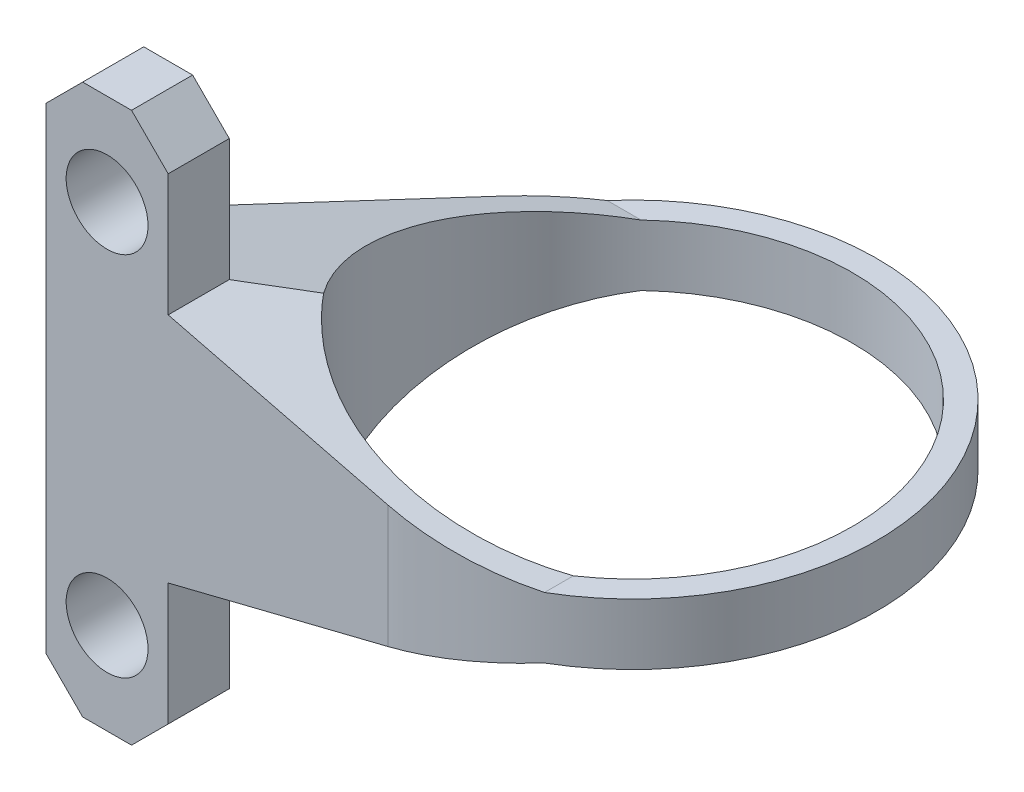
ISO-10303-21;
HEADER;
FILE_DESCRIPTION(('STEP AP214'),'2;1');
FILE_NAME('part.step','',(''),(''),'','','');
FILE_SCHEMA(('AUTOMOTIVE_DESIGN { 1 0 10303 214 1 1 1 1 }'));
ENDSEC;
DATA;
#1=APPLICATION_CONTEXT('core data for automotive mechanical design processes');
#2=APPLICATION_PROTOCOL_DEFINITION('international standard','automotive_design',2000,#1);
#3=PRODUCT_CONTEXT('',#1,'mechanical');
#4=PRODUCT('Part','Part','',(#3));
#5=PRODUCT_RELATED_PRODUCT_CATEGORY('part','',(#4));
#6=PRODUCT_DEFINITION_FORMATION('','',#4);
#7=PRODUCT_DEFINITION_CONTEXT('part definition',#1,'design');
#8=PRODUCT_DEFINITION('design','',#6,#7);
#9=PRODUCT_DEFINITION_SHAPE('','',#8);
#10=(LENGTH_UNIT() NAMED_UNIT(*) SI_UNIT(.MILLI.,.METRE.));
#11=(NAMED_UNIT(*) PLANE_ANGLE_UNIT() SI_UNIT($,.RADIAN.));
#12=(NAMED_UNIT(*) SI_UNIT($,.STERADIAN.) SOLID_ANGLE_UNIT());
#13=UNCERTAINTY_MEASURE_WITH_UNIT(LENGTH_MEASURE(1.E-05),#10,'distance_accuracy_value','');
#14=(GEOMETRIC_REPRESENTATION_CONTEXT(3) GLOBAL_UNCERTAINTY_ASSIGNED_CONTEXT((#13)) GLOBAL_UNIT_ASSIGNED_CONTEXT((#10,
#11,#12)) REPRESENTATION_CONTEXT('',''));
#15=CARTESIAN_POINT('',(0.,0.,0.));
#16=DIRECTION('',(0.,0.,1.));
#17=DIRECTION('',(1.,0.,0.));
#18=AXIS2_PLACEMENT_3D('',#15,#16,#17);
#19=CARTESIAN_POINT('',(0.,0.,0.));
#20=DIRECTION('',(0.,0.,1.));
#21=DIRECTION('',(1.,0.,0.));
#22=AXIS2_PLACEMENT_3D('',#19,#20,#21);
#23=PLANE('',#22);
#24=CARTESIAN_POINT('',(0.,-15.,0.));
#25=DIRECTION('',(0.,0.,1.));
#26=DIRECTION('',(1.,0.,0.));
#27=AXIS2_PLACEMENT_3D('',#24,#25,#26);
#28=CIRCLE('',#27,3.35);
#29=CARTESIAN_POINT('',(3.35,-15.,0.));
#30=VERTEX_POINT('',#29);
#31=EDGE_CURVE('E196',#30,#30,#28,.T.);
#32=ORIENTED_EDGE('',*,*,#31,.T.);
#33=EDGE_LOOP('',(#32));
#34=FACE_BOUND('',#33,.T.);
#35=DIRECTION('',(0.,-1.,0.));
#36=VECTOR('',#35,1.);
#37=CARTESIAN_POINT('',(-5.,22.5,0.));
#38=LINE('',#37,#36);
#39=CARTESIAN_POINT('',(-5.,-9.50000000000018,0.));
#40=VERTEX_POINT('',#39);
#41=CARTESIAN_POINT('',(-5.,-19.5,0.));
#42=VERTEX_POINT('',#41);
#43=EDGE_CURVE('E225',#40,#42,#38,.T.);
#44=ORIENTED_EDGE('',*,*,#43,.F.);
#45=DIRECTION('',(1.,0.,0.));
#46=VECTOR('',#45,1.);
#47=CARTESIAN_POINT('',(5.,-9.5000000000002,0.));
#48=LINE('',#47,#46);
#49=CARTESIAN_POINT('',(5.,-9.50000000000018,0.));
#50=VERTEX_POINT('',#49);
#51=EDGE_CURVE('E173',#40,#50,#48,.T.);
#52=ORIENTED_EDGE('',*,*,#51,.T.);
#53=DIRECTION('',(0.,1.,0.));
#54=VECTOR('',#53,1.);
#55=CARTESIAN_POINT('',(5.,22.5,0.));
#56=LINE('',#55,#54);
#57=CARTESIAN_POINT('',(5.,-19.5,0.));
#58=VERTEX_POINT('',#57);
#59=EDGE_CURVE('E219',#58,#50,#56,.T.);
#60=ORIENTED_EDGE('',*,*,#59,.F.);
#61=DIRECTION('',(0.707106781186548,0.707106781186547,0.));
#62=VECTOR('',#61,1.);
#63=CARTESIAN_POINT('',(5.,-19.5,0.));
#64=LINE('',#63,#62);
#65=CARTESIAN_POINT('',(1.99999999999999,-22.5,0.));
#66=VERTEX_POINT('',#65);
#67=EDGE_CURVE('E236',#58,#66,#64,.F.);
#68=ORIENTED_EDGE('',*,*,#67,.T.);
#69=DIRECTION('',(1.,0.,0.));
#70=VECTOR('',#69,1.);
#71=CARTESIAN_POINT('',(-5.,-22.5,0.));
#72=LINE('',#71,#70);
#73=CARTESIAN_POINT('',(-2.,-22.5,0.));
#74=VERTEX_POINT('',#73);
#75=EDGE_CURVE('E228',#74,#66,#72,.T.);
#76=ORIENTED_EDGE('',*,*,#75,.F.);
#77=DIRECTION('',(0.707106781186547,-0.707106781186548,0.));
#78=VECTOR('',#77,1.);
#79=CARTESIAN_POINT('',(-2.,-22.5,0.));
#80=LINE('',#79,#78);
#81=EDGE_CURVE('E239',#74,#42,#80,.F.);
#82=ORIENTED_EDGE('',*,*,#81,.T.);
#83=EDGE_LOOP('',(#44,#52,#60,#68,#76,#82));
#84=FACE_BOUND('',#83,.T.);
#85=ADVANCED_FACE('F39',(#34,#84),#23,.F.);
#86=CARTESIAN_POINT('',(5.,22.5,5.));
#87=DIRECTION('',(-1.,0.,0.));
#88=DIRECTION('',(0.,-1.,0.));
#89=AXIS2_PLACEMENT_3D('',#86,#87,#88);
#90=PLANE('',#89);
#91=ORIENTED_EDGE('',*,*,#59,.T.);
#92=DIRECTION('',(0.,0.,1.));
#93=VECTOR('',#92,1.);
#94=CARTESIAN_POINT('',(5.,-9.5000000000002,5.));
#95=LINE('',#94,#93);
#96=CARTESIAN_POINT('',(5.,-9.50000000000019,5.));
#97=VERTEX_POINT('',#96);
#98=EDGE_CURVE('E168',#50,#97,#95,.T.);
#99=ORIENTED_EDGE('',*,*,#98,.T.);
#100=DIRECTION('',(0.,1.,0.));
#101=VECTOR('',#100,1.);
#102=CARTESIAN_POINT('',(5.,22.5,5.));
#103=LINE('',#102,#101);
#104=CARTESIAN_POINT('',(5.,-19.5,5.));
#105=VERTEX_POINT('',#104);
#106=EDGE_CURVE('E205',#105,#97,#103,.T.);
#107=ORIENTED_EDGE('',*,*,#106,.F.);
#108=DIRECTION('',(0.,0.,-1.));
#109=VECTOR('',#108,1.);
#110=CARTESIAN_POINT('',(5.,-19.5,5.));
#111=LINE('',#110,#109);
#112=EDGE_CURVE('E260',#105,#58,#111,.T.);
#113=ORIENTED_EDGE('',*,*,#112,.T.);
#114=EDGE_LOOP('',(#91,#99,#107,#113));
#115=FACE_BOUND('',#114,.T.);
#116=ADVANCED_FACE('F387',(#115),#90,.F.);
#117=CARTESIAN_POINT('',(0.,0.,5.));
#118=DIRECTION('',(0.,0.,1.));
#119=DIRECTION('',(1.,0.,0.));
#120=AXIS2_PLACEMENT_3D('',#117,#118,#119);
#121=PLANE('',#120);
#122=CARTESIAN_POINT('',(0.,-15.,5.));
#123=DIRECTION('',(0.,0.,1.));
#124=DIRECTION('',(1.,0.,0.));
#125=AXIS2_PLACEMENT_3D('',#122,#123,#124);
#126=CIRCLE('',#125,3.35);
#127=CARTESIAN_POINT('',(3.35,-15.,5.));
#128=VERTEX_POINT('',#127);
#129=EDGE_CURVE('E199',#128,#128,#126,.T.);
#130=ORIENTED_EDGE('',*,*,#129,.F.);
#131=EDGE_LOOP('',(#130));
#132=FACE_BOUND('',#131,.T.);
#133=DIRECTION('',(0.,-1.,0.));
#134=VECTOR('',#133,1.);
#135=CARTESIAN_POINT('',(-5.,22.5,5.));
#136=LINE('',#135,#134);
#137=CARTESIAN_POINT('',(-5.,19.5,5.));
#138=VERTEX_POINT('',#137);
#139=CARTESIAN_POINT('',(-5.,-19.5,5.));
#140=VERTEX_POINT('',#139);
#141=EDGE_CURVE('E212',#138,#140,#136,.T.);
#142=ORIENTED_EDGE('',*,*,#141,.T.);
#143=DIRECTION('',(-0.707106781186547,0.707106781186548,0.));
#144=VECTOR('',#143,1.);
#145=CARTESIAN_POINT('',(-12.25,-12.25,5.));
#146=LINE('',#145,#144);
#147=CARTESIAN_POINT('',(-2.,-22.5,5.));
#148=VERTEX_POINT('',#147);
#149=EDGE_CURVE('E257',#140,#148,#146,.F.);
#150=ORIENTED_EDGE('',*,*,#149,.T.);
#151=DIRECTION('',(1.,0.,0.));
#152=VECTOR('',#151,1.);
#153=CARTESIAN_POINT('',(-5.,-22.5,5.));
#154=LINE('',#153,#152);
#155=CARTESIAN_POINT('',(1.99999999999999,-22.5,5.));
#156=VERTEX_POINT('',#155);
#157=EDGE_CURVE('E215',#148,#156,#154,.T.);
#158=ORIENTED_EDGE('',*,*,#157,.T.);
#159=DIRECTION('',(-0.707106781186548,-0.707106781186547,0.));
#160=VECTOR('',#159,1.);
#161=CARTESIAN_POINT('',(12.25,-12.25,5.));
#162=LINE('',#161,#160);
#163=EDGE_CURVE('E254',#156,#105,#162,.F.);
#164=ORIENTED_EDGE('',*,*,#163,.T.);
#165=ORIENTED_EDGE('',*,*,#106,.T.);
#166=DIRECTION('',(-0.970295726275997,-0.241921895599665,0.));
#167=VECTOR('',#166,1.);
#168=CARTESIAN_POINT('',(5.,-9.5000000000002,5.));
#169=LINE('',#168,#167);
#170=CARTESIAN_POINT('',(23.,-5.01209594882301,5.));
#171=VERTEX_POINT('',#170);
#172=EDGE_CURVE('E138',#97,#171,#169,.F.);
#173=ORIENTED_EDGE('',*,*,#172,.T.);
#174=DIRECTION('',(0.,1.,0.));
#175=VECTOR('',#174,1.);
#176=CARTESIAN_POINT('',(23.,-2.5,5.));
#177=LINE('',#176,#175);
#178=CARTESIAN_POINT('',(23.,5.012095948823,5.));
#179=VERTEX_POINT('',#178);
#180=EDGE_CURVE('E189',#171,#179,#177,.T.);
#181=ORIENTED_EDGE('',*,*,#180,.T.);
#182=DIRECTION('',(-0.970295726275997,0.241921895599665,0.));
#183=VECTOR('',#182,1.);
#184=CARTESIAN_POINT('',(33.0754665347521,2.5,5.));
#185=LINE('',#184,#183);
#186=CARTESIAN_POINT('',(5.,9.5000000000002,5.));
#187=VERTEX_POINT('',#186);
#188=EDGE_CURVE('E85',#179,#187,#185,.T.);
#189=ORIENTED_EDGE('',*,*,#188,.T.);
#190=CARTESIAN_POINT('',(5.,19.5,5.));
#191=VERTEX_POINT('',#190);
#192=EDGE_CURVE('E209',#187,#191,#103,.T.);
#193=ORIENTED_EDGE('',*,*,#192,.T.);
#194=DIRECTION('',(0.707106781186547,-0.707106781186548,0.));
#195=VECTOR('',#194,1.);
#196=CARTESIAN_POINT('',(12.25,12.25,5.));
#197=LINE('',#196,#195);
#198=CARTESIAN_POINT('',(2.,22.5,5.));
#199=VERTEX_POINT('',#198);
#200=EDGE_CURVE('E251',#191,#199,#197,.F.);
#201=ORIENTED_EDGE('',*,*,#200,.T.);
#202=DIRECTION('',(-1.,0.,0.));
#203=VECTOR('',#202,1.);
#204=CARTESIAN_POINT('',(-5.,22.5,5.));
#205=LINE('',#204,#203);
#206=CARTESIAN_POINT('',(-1.99999999999999,22.5,5.));
#207=VERTEX_POINT('',#206);
#208=EDGE_CURVE('E208',#199,#207,#205,.T.);
#209=ORIENTED_EDGE('',*,*,#208,.T.);
#210=DIRECTION('',(0.707106781186548,0.707106781186547,0.));
#211=VECTOR('',#210,1.);
#212=CARTESIAN_POINT('',(-12.25,12.25,5.));
#213=LINE('',#212,#211);
#214=EDGE_CURVE('E248',#207,#138,#213,.F.);
#215=ORIENTED_EDGE('',*,*,#214,.T.);
#216=EDGE_LOOP('',(#142,#150,#158,#164,#165,#173,#181,#189,#193,#201,#209,#215));
#217=FACE_BOUND('',#216,.T.);
#218=CARTESIAN_POINT('',(0.,15.,5.));
#219=DIRECTION('',(0.,0.,1.));
#220=DIRECTION('',(1.,0.,0.));
#221=AXIS2_PLACEMENT_3D('',#218,#219,#220);
#222=CIRCLE('',#221,3.35);
#223=CARTESIAN_POINT('',(3.34999999999999,15.,5.));
#224=VERTEX_POINT('',#223);
#225=EDGE_CURVE('E193',#224,#224,#222,.T.);
#226=ORIENTED_EDGE('',*,*,#225,.F.);
#227=EDGE_LOOP('',(#226));
#228=FACE_BOUND('',#227,.T.);
#229=ADVANCED_FACE('F350',(#132,#217,#228),#121,.T.);
#230=CARTESIAN_POINT('',(5.,9.5000000000002,0.));
#231=VERTEX_POINT('',#230);
#232=CARTESIAN_POINT('',(5.,19.5,0.));
#233=VERTEX_POINT('',#232);
#234=EDGE_CURVE('E202',#231,#233,#56,.T.);
#235=ORIENTED_EDGE('',*,*,#234,.F.);
#236=DIRECTION('',(-1.,0.,0.));
#237=VECTOR('',#236,1.);
#238=CARTESIAN_POINT('',(0.,9.5000000000002,0.));
#239=LINE('',#238,#237);
#240=CARTESIAN_POINT('',(-5.,9.5000000000002,0.));
#241=VERTEX_POINT('',#240);
#242=EDGE_CURVE('E284',#231,#241,#239,.T.);
#243=ORIENTED_EDGE('',*,*,#242,.T.);
#244=CARTESIAN_POINT('',(-5.,19.5,0.));
#245=VERTEX_POINT('',#244);
#246=EDGE_CURVE('E226',#245,#241,#38,.T.);
#247=ORIENTED_EDGE('',*,*,#246,.F.);
#248=DIRECTION('',(-0.707106781186548,-0.707106781186547,0.));
#249=VECTOR('',#248,1.);
#250=CARTESIAN_POINT('',(-5.,19.5,0.));
#251=LINE('',#250,#249);
#252=CARTESIAN_POINT('',(-1.99999999999999,22.5,0.));
#253=VERTEX_POINT('',#252);
#254=EDGE_CURVE('E269',#245,#253,#251,.F.);
#255=ORIENTED_EDGE('',*,*,#254,.T.);
#256=DIRECTION('',(-1.,0.,0.));
#257=VECTOR('',#256,1.);
#258=CARTESIAN_POINT('',(-5.,22.5,0.));
#259=LINE('',#258,#257);
#260=CARTESIAN_POINT('',(2.,22.5,0.));
#261=VERTEX_POINT('',#260);
#262=EDGE_CURVE('E222',#261,#253,#259,.T.);
#263=ORIENTED_EDGE('',*,*,#262,.F.);
#264=DIRECTION('',(-0.707106781186547,0.707106781186548,0.));
#265=VECTOR('',#264,1.);
#266=CARTESIAN_POINT('',(2.,22.5,0.));
#267=LINE('',#266,#265);
#268=EDGE_CURVE('E272',#261,#233,#267,.F.);
#269=ORIENTED_EDGE('',*,*,#268,.T.);
#270=EDGE_LOOP('',(#235,#243,#247,#255,#263,#269));
#271=FACE_BOUND('',#270,.T.);
#272=CARTESIAN_POINT('',(0.,15.,0.));
#273=DIRECTION('',(0.,0.,1.));
#274=DIRECTION('',(1.,0.,0.));
#275=AXIS2_PLACEMENT_3D('',#272,#273,#274);
#276=CIRCLE('',#275,3.35);
#277=CARTESIAN_POINT('',(3.34999999999999,15.,0.));
#278=VERTEX_POINT('',#277);
#279=EDGE_CURVE('E191',#278,#278,#276,.T.);
#280=ORIENTED_EDGE('',*,*,#279,.T.);
#281=EDGE_LOOP('',(#280));
#282=FACE_BOUND('',#281,.T.);
#283=ADVANCED_FACE('F312',(#271,#282),#23,.F.);
#284=ORIENTED_EDGE('',*,*,#192,.F.);
#285=DIRECTION('',(0.,0.,-1.));
#286=VECTOR('',#285,1.);
#287=CARTESIAN_POINT('',(5.,9.50000000000019,5.));
#288=LINE('',#287,#286);
#289=EDGE_CURVE('E282',#187,#231,#288,.T.);
#290=ORIENTED_EDGE('',*,*,#289,.T.);
#291=ORIENTED_EDGE('',*,*,#234,.T.);
#292=DIRECTION('',(0.,0.,1.));
#293=VECTOR('',#292,1.);
#294=CARTESIAN_POINT('',(5.,19.5,5.));
#295=LINE('',#294,#293);
#296=EDGE_CURVE('E275',#233,#191,#295,.T.);
#297=ORIENTED_EDGE('',*,*,#296,.T.);
#298=EDGE_LOOP('',(#284,#290,#291,#297));
#299=FACE_BOUND('',#298,.T.);
#300=ADVANCED_FACE('F310',(#299),#90,.F.);
#301=CARTESIAN_POINT('',(-5.,22.5,5.));
#302=DIRECTION('',(0.,-1.,0.));
#303=DIRECTION('',(0.,0.,-1.));
#304=AXIS2_PLACEMENT_3D('',#301,#302,#303);
#305=PLANE('',#304);
#306=ORIENTED_EDGE('',*,*,#208,.F.);
#307=DIRECTION('',(0.,0.,-1.));
#308=VECTOR('',#307,1.);
#309=CARTESIAN_POINT('',(2.,22.5,5.));
#310=LINE('',#309,#308);
#311=EDGE_CURVE('E266',#199,#261,#310,.T.);
#312=ORIENTED_EDGE('',*,*,#311,.T.);
#313=ORIENTED_EDGE('',*,*,#262,.T.);
#314=DIRECTION('',(0.,0.,1.));
#315=VECTOR('',#314,1.);
#316=CARTESIAN_POINT('',(-1.99999999999999,22.5,5.));
#317=LINE('',#316,#315);
#318=EDGE_CURVE('E263',#253,#207,#317,.T.);
#319=ORIENTED_EDGE('',*,*,#318,.T.);
#320=EDGE_LOOP('',(#306,#312,#313,#319));
#321=FACE_BOUND('',#320,.T.);
#322=ADVANCED_FACE('F345',(#321),#305,.F.);
#323=CARTESIAN_POINT('',(-5.,22.5,5.));
#324=DIRECTION('',(1.,0.,0.));
#325=DIRECTION('',(0.,1.,0.));
#326=AXIS2_PLACEMENT_3D('',#323,#324,#325);
#327=PLANE('',#326);
#328=DIRECTION('',(0.,1.,0.));
#329=VECTOR('',#328,1.);
#330=CARTESIAN_POINT('',(-5.,-2.5,0.));
#331=LINE('',#330,#329);
#332=EDGE_CURVE('E57',#40,#241,#331,.T.);
#333=ORIENTED_EDGE('',*,*,#332,.F.);
#334=ORIENTED_EDGE('',*,*,#43,.T.);
#335=DIRECTION('',(0.,0.,1.));
#336=VECTOR('',#335,1.);
#337=CARTESIAN_POINT('',(-5.,-19.5,5.));
#338=LINE('',#337,#336);
#339=EDGE_CURVE('E245',#42,#140,#338,.T.);
#340=ORIENTED_EDGE('',*,*,#339,.T.);
#341=ORIENTED_EDGE('',*,*,#141,.F.);
#342=DIRECTION('',(0.,0.,-1.));
#343=VECTOR('',#342,1.);
#344=CARTESIAN_POINT('',(-5.,19.5,5.));
#345=LINE('',#344,#343);
#346=EDGE_CURVE('E242',#138,#245,#345,.T.);
#347=ORIENTED_EDGE('',*,*,#346,.T.);
#348=ORIENTED_EDGE('',*,*,#246,.T.);
#349=EDGE_LOOP('',(#333,#334,#340,#341,#347,#348));
#350=FACE_BOUND('',#349,.T.);
#351=ADVANCED_FACE('F354',(#350),#327,.F.);
#352=CARTESIAN_POINT('',(-5.,-22.5,5.));
#353=DIRECTION('',(0.,1.,0.));
#354=DIRECTION('',(0.,0.,1.));
#355=AXIS2_PLACEMENT_3D('',#352,#353,#354);
#356=PLANE('',#355);
#357=ORIENTED_EDGE('',*,*,#157,.F.);
#358=DIRECTION('',(0.,0.,-1.));
#359=VECTOR('',#358,1.);
#360=CARTESIAN_POINT('',(-2.,-22.5,5.));
#361=LINE('',#360,#359);
#362=EDGE_CURVE('E233',#148,#74,#361,.T.);
#363=ORIENTED_EDGE('',*,*,#362,.T.);
#364=ORIENTED_EDGE('',*,*,#75,.T.);
#365=DIRECTION('',(0.,0.,1.));
#366=VECTOR('',#365,1.);
#367=CARTESIAN_POINT('',(1.99999999999999,-22.5,5.));
#368=LINE('',#367,#366);
#369=EDGE_CURVE('E218',#66,#156,#368,.T.);
#370=ORIENTED_EDGE('',*,*,#369,.T.);
#371=EDGE_LOOP('',(#357,#363,#364,#370));
#372=FACE_BOUND('',#371,.T.);
#373=ADVANCED_FACE('F382',(#372),#356,.F.);
#374=CARTESIAN_POINT('',(0.,-15.,5.));
#375=DIRECTION('',(0.,0.,-1.));
#376=DIRECTION('',(-1.,0.,0.));
#377=AXIS2_PLACEMENT_3D('',#374,#375,#376);
#378=CYLINDRICAL_SURFACE('',#377,3.35);
#379=ORIENTED_EDGE('',*,*,#129,.T.);
#380=EDGE_LOOP('',(#379));
#381=FACE_BOUND('',#380,.T.);
#382=ORIENTED_EDGE('',*,*,#31,.F.);
#383=EDGE_LOOP('',(#382));
#384=FACE_BOUND('',#383,.T.);
#385=ADVANCED_FACE('F411',(#381,#384),#378,.F.);
#386=CARTESIAN_POINT('',(0.,15.,5.));
#387=DIRECTION('',(0.,0.,-1.));
#388=DIRECTION('',(-1.,0.,0.));
#389=AXIS2_PLACEMENT_3D('',#386,#387,#388);
#390=CYLINDRICAL_SURFACE('',#389,3.35);
#391=ORIENTED_EDGE('',*,*,#225,.T.);
#392=EDGE_LOOP('',(#391));
#393=FACE_BOUND('',#392,.T.);
#394=ORIENTED_EDGE('',*,*,#279,.F.);
#395=EDGE_LOOP('',(#394));
#396=FACE_BOUND('',#395,.T.);
#397=ADVANCED_FACE('F429',(#393,#396),#390,.F.);
#398=CARTESIAN_POINT('',(23.,-2.5,-15.));
#399=DIRECTION('',(0.,1.,0.));
#400=DIRECTION('',(0.,0.,1.));
#401=AXIS2_PLACEMENT_3D('',#398,#399,#400);
#402=CYLINDRICAL_SURFACE('',#401,20.);
#403=DIRECTION('',(0.,1.,0.));
#404=VECTOR('',#403,1.);
#405=CARTESIAN_POINT('',(4.56255935822414,-2.5,-22.7498891979816));
#406=LINE('',#405,#404);
#407=CARTESIAN_POINT('',(4.56255935822414,-3.82781556136387,-22.7498891979816));
#408=VERTEX_POINT('',#407);
#409=CARTESIAN_POINT('',(4.56255935822414,3.82781556136387,-22.7498891979816));
#410=VERTEX_POINT('',#409);
#411=EDGE_CURVE('E65',#408,#410,#406,.T.);
#412=ORIENTED_EDGE('',*,*,#411,.T.);
#413=CARTESIAN_POINT('',(23.,5.76007995735254,-15.));
#414=DIRECTION('',(0.,-0.970295726275997,0.241921895599665));
#415=DIRECTION('',(0.,0.241921895599665,0.970295726275997));
#416=AXIS2_PLACEMENT_3D('',#413,#414,#415);
#417=ELLIPSE('',#416,20.6122725869979,20.);
#418=CARTESIAN_POINT('',(7.86619099834485,2.5,-28.0754665347521));
#419=VERTEX_POINT('',#418);
#420=EDGE_CURVE('E119',#410,#419,#417,.T.);
#421=ORIENTED_EDGE('',*,*,#420,.T.);
#422=CARTESIAN_POINT('',(23.,2.5,-15.));
#423=DIRECTION('',(0.,1.,0.));
#424=DIRECTION('',(0.,0.,1.));
#425=AXIS2_PLACEMENT_3D('',#422,#423,#424);
#426=CIRCLE('',#425,20.);
#427=CARTESIAN_POINT('',(33.0754665347521,2.5,2.27671768904877));
#428=VERTEX_POINT('',#427);
#429=EDGE_CURVE('E158',#428,#419,#426,.T.);
#430=ORIENTED_EDGE('',*,*,#429,.F.);
#431=CARTESIAN_POINT('',(23.,5.012095948823,-15.));
#432=DIRECTION('',(-0.241921895599665,-0.970295726275997,0.));
#433=DIRECTION('',(-0.970295726275997,0.241921895599665,0.));
#434=AXIS2_PLACEMENT_3D('',#431,#432,#433);
#435=ELLIPSE('',#434,20.6122725869979,20.);
#436=EDGE_CURVE('E290',#428,#179,#435,.T.);
#437=ORIENTED_EDGE('',*,*,#436,.T.);
#438=ORIENTED_EDGE('',*,*,#180,.F.);
#439=CARTESIAN_POINT('',(23.,-5.01209594882301,-15.));
#440=DIRECTION('',(0.241921895599665,-0.970295726275997,0.));
#441=DIRECTION('',(0.970295726275997,0.241921895599665,0.));
#442=AXIS2_PLACEMENT_3D('',#439,#440,#441);
#443=ELLIPSE('',#442,20.6122725869979,20.);
#444=CARTESIAN_POINT('',(33.0754665347521,-2.5,2.27671768904877));
#445=VERTEX_POINT('',#444);
#446=EDGE_CURVE('E141',#171,#445,#443,.F.);
#447=ORIENTED_EDGE('',*,*,#446,.T.);
#448=CARTESIAN_POINT('',(23.,-2.5,-15.));
#449=DIRECTION('',(0.,1.,0.));
#450=DIRECTION('',(0.,0.,1.));
#451=AXIS2_PLACEMENT_3D('',#448,#449,#450);
#452=CIRCLE('',#451,20.);
#453=CARTESIAN_POINT('',(7.86619099834485,-2.5,-28.0754665347521));
#454=VERTEX_POINT('',#453);
#455=EDGE_CURVE('E124',#445,#454,#452,.T.);
#456=ORIENTED_EDGE('',*,*,#455,.T.);
#457=CARTESIAN_POINT('',(23.,-5.76007995735254,-15.));
#458=DIRECTION('',(0.,-0.970295726275997,-0.241921895599665));
#459=DIRECTION('',(0.,0.241921895599665,-0.970295726275997));
#460=AXIS2_PLACEMENT_3D('',#457,#458,#459);
#461=ELLIPSE('',#460,20.6122725869979,20.);
#462=EDGE_CURVE('E49',#454,#408,#461,.F.);
#463=ORIENTED_EDGE('',*,*,#462,.T.);
#464=EDGE_LOOP('',(#412,#421,#430,#437,#438,#447,#456,#463));
#465=FACE_BOUND('',#464,.T.);
#466=ADVANCED_FACE('F115',(#465),#402,.T.);
#467=CARTESIAN_POINT('',(-5.,-2.5,0.));
#468=DIRECTION('',(-0.921872032088793,0.,-0.38749445989908));
#469=DIRECTION('',(-0.38749445989908,0.,0.921872032088793));
#470=AXIS2_PLACEMENT_3D('',#467,#468,#469);
#471=PLANE('',#470);
#472=ORIENTED_EDGE('',*,*,#332,.T.);
#473=DIRECTION('',(0.377647228702608,-0.224007470562658,-0.898444891902314));
#474=VECTOR('',#473,1.);
#475=CARTESIAN_POINT('',(9.1113303196865,1.12963959236062,-33.5716819297846));
#476=LINE('',#475,#474);
#477=EDGE_CURVE('E127',#241,#410,#476,.T.);
#478=ORIENTED_EDGE('',*,*,#477,.T.);
#479=ORIENTED_EDGE('',*,*,#411,.F.);
#480=DIRECTION('',(0.377647228702608,0.224007470562658,-0.898444891902314));
#481=VECTOR('',#480,1.);
#482=CARTESIAN_POINT('',(-4.2869128532662,-9.07702099766685,-1.69647611784462));
#483=LINE('',#482,#481);
#484=EDGE_CURVE('E11',#408,#40,#483,.F.);
#485=ORIENTED_EDGE('',*,*,#484,.T.);
#486=EDGE_LOOP('',(#472,#478,#479,#485));
#487=FACE_BOUND('',#486,.T.);
#488=ADVANCED_FACE('F128',(#487),#471,.T.);
#489=CARTESIAN_POINT('',(23.,-2.5,-15.));
#490=DIRECTION('',(0.,1.,0.));
#491=DIRECTION('',(0.,0.,1.));
#492=AXIS2_PLACEMENT_3D('',#489,#490,#491);
#493=PLANE('',#492);
#494=ORIENTED_EDGE('',*,*,#455,.F.);
#495=DIRECTION('',(0.,0.,-1.));
#496=VECTOR('',#495,1.);
#497=CARTESIAN_POINT('',(33.0754665347521,-2.5,0.));
#498=LINE('',#497,#496);
#499=CARTESIAN_POINT('',(33.0754665347521,-2.5,-0.0840697874020923));
#500=VERTEX_POINT('',#499);
#501=EDGE_CURVE('E184',#445,#500,#498,.T.);
#502=ORIENTED_EDGE('',*,*,#501,.T.);
#503=CARTESIAN_POINT('',(23.,-2.5,-15.));
#504=DIRECTION('',(0.,1.,0.));
#505=DIRECTION('',(0.,0.,1.));
#506=AXIS2_PLACEMENT_3D('',#503,#504,#505);
#507=CIRCLE('',#506,18.);
#508=CARTESIAN_POINT('',(10.6293825983268,-2.5,-28.0754665347521));
#509=VERTEX_POINT('',#508);
#510=EDGE_CURVE('E180',#500,#509,#507,.T.);
#511=ORIENTED_EDGE('',*,*,#510,.T.);
#512=DIRECTION('',(-1.,0.,0.));
#513=VECTOR('',#512,1.);
#514=CARTESIAN_POINT('',(-5.,-2.5,-28.0754665347521));
#515=LINE('',#514,#513);
#516=EDGE_CURVE('E174',#509,#454,#515,.T.);
#517=ORIENTED_EDGE('',*,*,#516,.T.);
#518=EDGE_LOOP('',(#494,#502,#511,#517));
#519=FACE_BOUND('',#518,.T.);
#520=ADVANCED_FACE('F183',(#519),#493,.F.);
#521=CARTESIAN_POINT('',(23.,-2.5,-15.));
#522=DIRECTION('',(0.,1.,0.));
#523=DIRECTION('',(0.,0.,1.));
#524=AXIS2_PLACEMENT_3D('',#521,#522,#523);
#525=CYLINDRICAL_SURFACE('',#524,18.);
#526=ORIENTED_EDGE('',*,*,#510,.F.);
#527=CARTESIAN_POINT('',(23.,-5.01209594882301,-15.));
#528=DIRECTION('',(0.241921895599665,-0.970295726275997,0.));
#529=DIRECTION('',(0.970295726275997,0.241921895599665,0.));
#530=AXIS2_PLACEMENT_3D('',#527,#528,#529);
#531=ELLIPSE('',#530,18.5510453282982,18.);
#532=CARTESIAN_POINT('',(8.86077534023546,-8.53740059499311,-3.86077534023545));
#533=VERTEX_POINT('',#532);
#534=EDGE_CURVE('E146',#500,#533,#531,.T.);
#535=ORIENTED_EDGE('',*,*,#534,.T.);
#536=CARTESIAN_POINT('',(23.,-5.76007995735254,-15.));
#537=DIRECTION('',(0.,-0.970295726275997,-0.241921895599665));
#538=DIRECTION('',(0.,0.241921895599665,-0.970295726275997));
#539=AXIS2_PLACEMENT_3D('',#536,#537,#538);
#540=ELLIPSE('',#539,18.5510453282982,18.);
#541=EDGE_CURVE('E148',#533,#509,#540,.T.);
#542=ORIENTED_EDGE('',*,*,#541,.T.);
#543=EDGE_LOOP('',(#526,#535,#542));
#544=FACE_BOUND('',#543,.T.);
#545=CARTESIAN_POINT('',(23.,2.5,-15.));
#546=DIRECTION('',(0.,1.,0.));
#547=DIRECTION('',(0.,0.,1.));
#548=AXIS2_PLACEMENT_3D('',#545,#546,#547);
#549=CIRCLE('',#548,18.);
#550=CARTESIAN_POINT('',(33.0754665347521,2.5,-0.0840697874020923));
#551=VERTEX_POINT('',#550);
#552=CARTESIAN_POINT('',(10.6293825983268,2.5,-28.0754665347521));
#553=VERTEX_POINT('',#552);
#554=EDGE_CURVE('E152',#551,#553,#549,.T.);
#555=ORIENTED_EDGE('',*,*,#554,.T.);
#556=CARTESIAN_POINT('',(23.,5.76007995735254,-15.));
#557=DIRECTION('',(0.,-0.970295726275997,0.241921895599665));
#558=DIRECTION('',(0.,0.241921895599665,0.970295726275997));
#559=AXIS2_PLACEMENT_3D('',#556,#557,#558);
#560=ELLIPSE('',#559,18.5510453282982,18.);
#561=CARTESIAN_POINT('',(8.86077534023545,8.5374005949931,-3.86077534023546));
#562=VERTEX_POINT('',#561);
#563=EDGE_CURVE('E131',#553,#562,#560,.F.);
#564=ORIENTED_EDGE('',*,*,#563,.T.);
#565=CARTESIAN_POINT('',(23.,5.012095948823,-15.));
#566=DIRECTION('',(-0.241921895599665,-0.970295726275997,0.));
#567=DIRECTION('',(-0.970295726275997,0.241921895599665,0.));
#568=AXIS2_PLACEMENT_3D('',#565,#566,#567);
#569=ELLIPSE('',#568,18.5510453282982,18.);
#570=EDGE_CURVE('E294',#562,#551,#569,.F.);
#571=ORIENTED_EDGE('',*,*,#570,.T.);
#572=EDGE_LOOP('',(#555,#564,#571));
#573=FACE_BOUND('',#572,.T.);
#574=ADVANCED_FACE('F178',(#544,#573),#525,.F.);
#575=CARTESIAN_POINT('',(23.,2.5,-15.));
#576=DIRECTION('',(0.,1.,0.));
#577=DIRECTION('',(0.,0.,1.));
#578=AXIS2_PLACEMENT_3D('',#575,#576,#577);
#579=PLANE('',#578);
#580=ORIENTED_EDGE('',*,*,#554,.F.);
#581=DIRECTION('',(0.,0.,1.));
#582=VECTOR('',#581,1.);
#583=CARTESIAN_POINT('',(33.0754665347521,2.5,-15.));
#584=LINE('',#583,#582);
#585=EDGE_CURVE('E279',#551,#428,#584,.T.);
#586=ORIENTED_EDGE('',*,*,#585,.T.);
#587=ORIENTED_EDGE('',*,*,#429,.T.);
#588=DIRECTION('',(1.,0.,0.));
#589=VECTOR('',#588,1.);
#590=CARTESIAN_POINT('',(23.,2.5,-28.0754665347521));
#591=LINE('',#590,#589);
#592=EDGE_CURVE('E137',#419,#553,#591,.T.);
#593=ORIENTED_EDGE('',*,*,#592,.T.);
#594=EDGE_LOOP('',(#580,#586,#587,#593));
#595=FACE_BOUND('',#594,.T.);
#596=ADVANCED_FACE('F304',(#595),#579,.T.);
#597=CARTESIAN_POINT('',(-2.,-22.5,5.));
#598=DIRECTION('',(0.707106781186548,0.707106781186547,0.));
#599=DIRECTION('',(0.,0.,-1.));
#600=AXIS2_PLACEMENT_3D('',#597,#598,#599);
#601=PLANE('',#600);
#602=ORIENTED_EDGE('',*,*,#149,.F.);
#603=ORIENTED_EDGE('',*,*,#339,.F.);
#604=ORIENTED_EDGE('',*,*,#81,.F.);
#605=ORIENTED_EDGE('',*,*,#362,.F.);
#606=EDGE_LOOP('',(#602,#603,#604,#605));
#607=FACE_BOUND('',#606,.T.);
#608=ADVANCED_FACE('F359',(#607),#601,.F.);
#609=CARTESIAN_POINT('',(5.,-19.5,5.));
#610=DIRECTION('',(-0.707106781186547,0.707106781186548,0.));
#611=DIRECTION('',(0.,0.,-1.));
#612=AXIS2_PLACEMENT_3D('',#609,#610,#611);
#613=PLANE('',#612);
#614=ORIENTED_EDGE('',*,*,#163,.F.);
#615=ORIENTED_EDGE('',*,*,#369,.F.);
#616=ORIENTED_EDGE('',*,*,#67,.F.);
#617=ORIENTED_EDGE('',*,*,#112,.F.);
#618=EDGE_LOOP('',(#614,#615,#616,#617));
#619=FACE_BOUND('',#618,.T.);
#620=ADVANCED_FACE('F384',(#619),#613,.F.);
#621=CARTESIAN_POINT('',(2.,22.5,5.));
#622=DIRECTION('',(-0.707106781186548,-0.707106781186547,0.));
#623=DIRECTION('',(0.,0.,-1.));
#624=AXIS2_PLACEMENT_3D('',#621,#622,#623);
#625=PLANE('',#624);
#626=ORIENTED_EDGE('',*,*,#200,.F.);
#627=ORIENTED_EDGE('',*,*,#296,.F.);
#628=ORIENTED_EDGE('',*,*,#268,.F.);
#629=ORIENTED_EDGE('',*,*,#311,.F.);
#630=EDGE_LOOP('',(#626,#627,#628,#629));
#631=FACE_BOUND('',#630,.T.);
#632=ADVANCED_FACE('F324',(#631),#625,.F.);
#633=CARTESIAN_POINT('',(-5.,19.5,5.));
#634=DIRECTION('',(0.707106781186547,-0.707106781186547,0.));
#635=DIRECTION('',(0.,0.,-1.));
#636=AXIS2_PLACEMENT_3D('',#633,#634,#635);
#637=PLANE('',#636);
#638=ORIENTED_EDGE('',*,*,#214,.F.);
#639=ORIENTED_EDGE('',*,*,#318,.F.);
#640=ORIENTED_EDGE('',*,*,#254,.F.);
#641=ORIENTED_EDGE('',*,*,#346,.F.);
#642=EDGE_LOOP('',(#638,#639,#640,#641));
#643=FACE_BOUND('',#642,.T.);
#644=ADVANCED_FACE('F347',(#643),#637,.F.);
#645=CARTESIAN_POINT('',(23.,2.5,-28.0754665347521));
#646=DIRECTION('',(0.,-0.970295726275997,0.241921895599665));
#647=DIRECTION('',(1.,0.,0.));
#648=AXIS2_PLACEMENT_3D('',#645,#646,#647);
#649=PLANE('',#648);
#650=ORIENTED_EDGE('',*,*,#477,.F.);
#651=ORIENTED_EDGE('',*,*,#242,.F.);
#652=DIRECTION('',(-0.696367271932416,0.173623861156261,0.696367271932416));
#653=VECTOR('',#652,1.);
#654=CARTESIAN_POINT('',(26.7348148395301,4.08090202389389,-21.7348148395301));
#655=LINE('',#654,#653);
#656=EDGE_CURVE('E150',#562,#231,#655,.T.);
#657=ORIENTED_EDGE('',*,*,#656,.F.);
#658=ORIENTED_EDGE('',*,*,#563,.F.);
#659=ORIENTED_EDGE('',*,*,#592,.F.);
#660=ORIENTED_EDGE('',*,*,#420,.F.);
#661=EDGE_LOOP('',(#650,#651,#657,#658,#659,#660));
#662=FACE_BOUND('',#661,.T.);
#663=ADVANCED_FACE('F134',(#662),#649,.F.);
#664=CARTESIAN_POINT('',(33.0754665347521,2.5,-15.));
#665=DIRECTION('',(-0.241921895599665,-0.970295726275997,0.));
#666=DIRECTION('',(0.,0.,1.));
#667=AXIS2_PLACEMENT_3D('',#664,#665,#666);
#668=PLANE('',#667);
#669=ORIENTED_EDGE('',*,*,#656,.T.);
#670=ORIENTED_EDGE('',*,*,#289,.F.);
#671=ORIENTED_EDGE('',*,*,#188,.F.);
#672=ORIENTED_EDGE('',*,*,#436,.F.);
#673=ORIENTED_EDGE('',*,*,#585,.F.);
#674=ORIENTED_EDGE('',*,*,#570,.F.);
#675=EDGE_LOOP('',(#669,#670,#671,#672,#673,#674));
#676=FACE_BOUND('',#675,.T.);
#677=ADVANCED_FACE('F299',(#676),#668,.F.);
#678=CARTESIAN_POINT('',(0.,-9.5000000000002,0.));
#679=DIRECTION('',(0.,-0.970295726275997,-0.241921895599665));
#680=DIRECTION('',(-1.,0.,0.));
#681=AXIS2_PLACEMENT_3D('',#678,#679,#680);
#682=PLANE('',#681);
#683=ORIENTED_EDGE('',*,*,#516,.F.);
#684=ORIENTED_EDGE('',*,*,#541,.F.);
#685=DIRECTION('',(0.696367271932416,0.173623861156261,-0.696367271932416));
#686=VECTOR('',#685,1.);
#687=CARTESIAN_POINT('',(2.57536311290703,-10.104529872679,2.42463688709299));
#688=LINE('',#687,#686);
#689=EDGE_CURVE('E44',#50,#533,#688,.T.);
#690=ORIENTED_EDGE('',*,*,#689,.F.);
#691=ORIENTED_EDGE('',*,*,#51,.F.);
#692=ORIENTED_EDGE('',*,*,#484,.F.);
#693=ORIENTED_EDGE('',*,*,#462,.F.);
#694=EDGE_LOOP('',(#683,#684,#690,#691,#692,#693));
#695=FACE_BOUND('',#694,.T.);
#696=ADVANCED_FACE('F42',(#695),#682,.T.);
#697=CARTESIAN_POINT('',(5.,-9.5000000000002,5.));
#698=DIRECTION('',(0.241921895599665,-0.970295726275997,0.));
#699=DIRECTION('',(0.,0.,-1.));
#700=AXIS2_PLACEMENT_3D('',#697,#698,#699);
#701=PLANE('',#700);
#702=ORIENTED_EDGE('',*,*,#534,.F.);
#703=ORIENTED_EDGE('',*,*,#501,.F.);
#704=ORIENTED_EDGE('',*,*,#446,.F.);
#705=ORIENTED_EDGE('',*,*,#172,.F.);
#706=ORIENTED_EDGE('',*,*,#98,.F.);
#707=ORIENTED_EDGE('',*,*,#689,.T.);
#708=EDGE_LOOP('',(#702,#703,#704,#705,#706,#707));
#709=FACE_BOUND('',#708,.T.);
#710=ADVANCED_FACE('F165',(#709),#701,.T.);
#711=CLOSED_SHELL('',(#85,#116,#229,#283,#300,#322,#351,#373,#385,#397,#466,#488,#520,#574,#596,
#608,#620,#632,#644,#663,#677,#696,#710));
#712=MANIFOLD_SOLID_BREP('B2',#711);
#713=ADVANCED_BREP_SHAPE_REPRESENTATION('',(#18,#712),#14);
#714=SHAPE_DEFINITION_REPRESENTATION(#9,#713);
ENDSEC;
END-ISO-10303-21;
